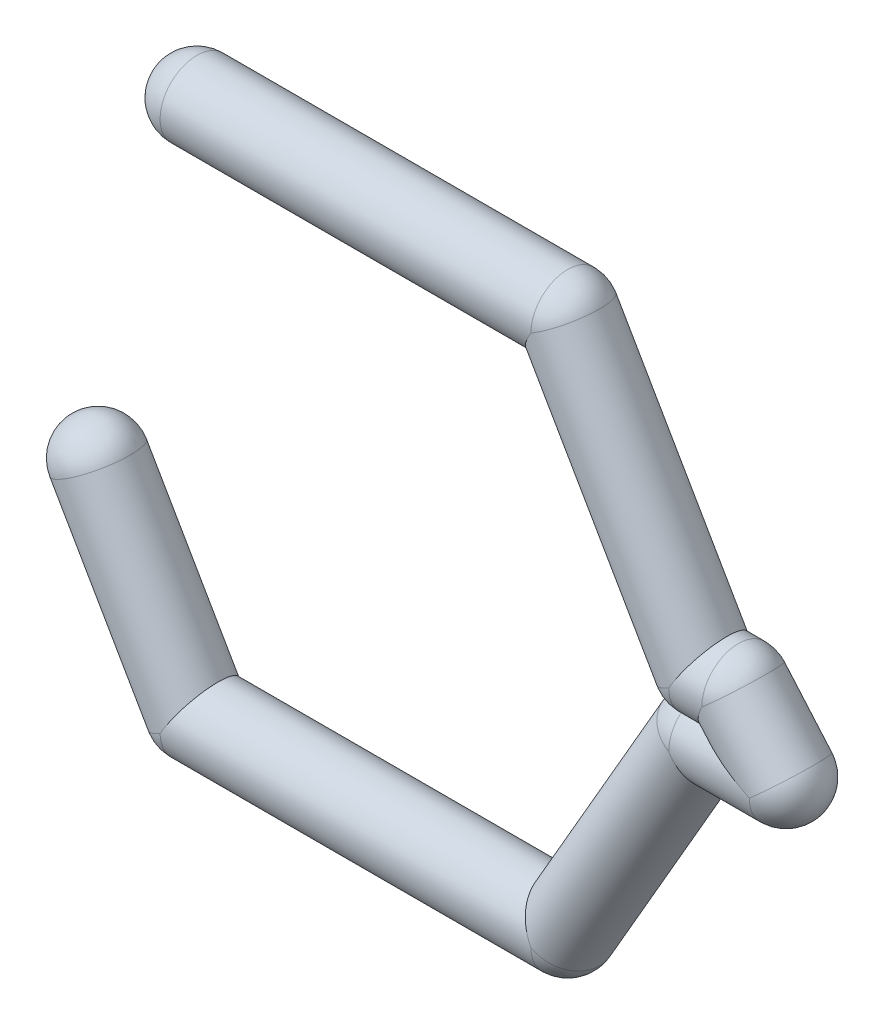
ISO-10303-21;
HEADER;
FILE_DESCRIPTION(('STEP AP214'),'2;1');
FILE_NAME('part.step','',(''),(''),'','','');
FILE_SCHEMA(('AUTOMOTIVE_DESIGN { 1 0 10303 214 1 1 1 1 }'));
ENDSEC;
DATA;
#1=APPLICATION_CONTEXT('core data for automotive mechanical design processes');
#2=APPLICATION_PROTOCOL_DEFINITION('international standard','automotive_design',2000,#1);
#3=PRODUCT_CONTEXT('',#1,'mechanical');
#4=PRODUCT('Part','Part','',(#3));
#5=PRODUCT_RELATED_PRODUCT_CATEGORY('part','',(#4));
#6=PRODUCT_DEFINITION_FORMATION('','',#4);
#7=PRODUCT_DEFINITION_CONTEXT('part definition',#1,'design');
#8=PRODUCT_DEFINITION('design','',#6,#7);
#9=PRODUCT_DEFINITION_SHAPE('','',#8);
#10=(LENGTH_UNIT() NAMED_UNIT(*) SI_UNIT(.MILLI.,.METRE.));
#11=(NAMED_UNIT(*) PLANE_ANGLE_UNIT() SI_UNIT($,.RADIAN.));
#12=(NAMED_UNIT(*) SI_UNIT($,.STERADIAN.) SOLID_ANGLE_UNIT());
#13=UNCERTAINTY_MEASURE_WITH_UNIT(LENGTH_MEASURE(1.E-05),#10,'distance_accuracy_value','');
#14=(GEOMETRIC_REPRESENTATION_CONTEXT(3) GLOBAL_UNCERTAINTY_ASSIGNED_CONTEXT((#13)) GLOBAL_UNIT_ASSIGNED_CONTEXT((#10,
#11,#12)) REPRESENTATION_CONTEXT('',''));
#15=CARTESIAN_POINT('',(0.,0.,0.));
#16=DIRECTION('',(0.,0.,1.));
#17=DIRECTION('',(1.,0.,0.));
#18=AXIS2_PLACEMENT_3D('',#15,#16,#17);
#19=CARTESIAN_POINT('',(-15.16,-4.283,1.125));
#20=DIRECTION('',(1.,0.,0.));
#21=DIRECTION('',(0.,-1.,0.));
#22=AXIS2_PLACEMENT_3D('',#19,#20,#21);
#23=SPHERICAL_SURFACE('',#22,0.24);
#24=CARTESIAN_POINT('',(-15.16,-4.283,1.125));
#25=DIRECTION('',(-0.500057999393756,0.865991915229187,0.));
#26=DIRECTION('',(-0.865991915229187,-0.500057999393756,0.));
#27=AXIS2_PLACEMENT_3D('',#24,#25,#26);
#28=SPHERICAL_SURFACE('',#27,0.24);
#29=CARTESIAN_POINT('',(-15.16,-4.283,1.125));
#30=DIRECTION('',(-0.500057999393756,0.865991915229187,0.));
#31=DIRECTION('',(-0.865991915229187,-0.500057999393756,0.));
#32=AXIS2_PLACEMENT_3D('',#29,#30,#31);
#33=CIRCLE('',#32,0.24);
#34=CARTESIAN_POINT('',(-15.367838059655,-4.4030139198545,1.125));
#35=VERTEX_POINT('',#34);
#36=EDGE_CURVE('E88',#35,#35,#33,.F.);
#37=ORIENTED_EDGE('',*,*,#36,.F.);
#38=EDGE_LOOP('',(#37));
#39=FACE_BOUND('',#38,.T.);
#40=ADVANCED_FACE('F81',(#39),#28,.T.);
#41=CARTESIAN_POINT('',(-14.515,-5.4,1.125));
#42=DIRECTION('',(-0.500057999393756,0.865991915229187,0.));
#43=DIRECTION('',(-0.865991915229187,-0.500057999393756,0.));
#44=AXIS2_PLACEMENT_3D('',#41,#42,#43);
#45=CYLINDRICAL_SURFACE('',#44,0.240000000000001);
#46=CARTESIAN_POINT('',(-14.515,-5.4,1.125));
#47=DIRECTION('',(-0.866042146605393,0.499970999462091,0.));
#48=DIRECTION('',(0.499970999462091,0.866042146605394,0.));
#49=AXIS2_PLACEMENT_3D('',#46,#47,#48);
#50=ELLIPSE('',#49,0.277122771611893,0.24);
#51=CARTESIAN_POINT('',(-14.515,-5.4,0.884999999999999));
#52=VERTEX_POINT('',#51);
#53=CARTESIAN_POINT('',(-14.515,-5.4,1.365));
#54=VERTEX_POINT('',#53);
#55=EDGE_CURVE('E12',#52,#54,#50,.F.);
#56=ORIENTED_EDGE('',*,*,#55,.F.);
#57=CARTESIAN_POINT('',(-14.515,-5.4,1.125));
#58=DIRECTION('',(-0.500057999393757,0.865991915229186,0.));
#59=DIRECTION('',(-0.865991915229186,-0.500057999393757,0.));
#60=AXIS2_PLACEMENT_3D('',#57,#58,#59);
#61=CIRCLE('',#60,0.240000000000001);
#62=EDGE_CURVE('E94',#52,#54,#61,.T.);
#63=ORIENTED_EDGE('',*,*,#62,.T.);
#64=EDGE_LOOP('',(#56,#63));
#65=FACE_BOUND('',#64,.T.);
#66=ORIENTED_EDGE('',*,*,#36,.T.);
#67=EDGE_LOOP('',(#66));
#68=FACE_BOUND('',#67,.T.);
#69=ADVANCED_FACE('F212',(#65,#68),#45,.T.);
#70=CARTESIAN_POINT('',(-14.515,-5.4,1.125));
#71=DIRECTION('',(1.,0.,0.));
#72=DIRECTION('',(0.,-1.,0.));
#73=AXIS2_PLACEMENT_3D('',#70,#71,#72);
#74=SPHERICAL_SURFACE('',#73,0.24);
#75=ORIENTED_EDGE('',*,*,#62,.F.);
#76=CARTESIAN_POINT('',(-14.515,-5.4,1.125));
#77=DIRECTION('',(-1.,0.,0.));
#78=DIRECTION('',(0.,0.,1.));
#79=AXIS2_PLACEMENT_3D('',#76,#77,#78);
#80=CIRCLE('',#79,0.24);
#81=EDGE_CURVE('E203',#54,#52,#80,.F.);
#82=ORIENTED_EDGE('',*,*,#81,.F.);
#83=EDGE_LOOP('',(#75,#82));
#84=FACE_BOUND('',#83,.T.);
#85=ADVANCED_FACE('F218',(#84),#74,.T.);
#86=CARTESIAN_POINT('',(-12.09,-5.4,1.125));
#87=DIRECTION('',(-1.,0.,0.));
#88=DIRECTION('',(0.,0.,1.));
#89=AXIS2_PLACEMENT_3D('',#86,#87,#88);
#90=CYLINDRICAL_SURFACE('',#89,0.24);
#91=CARTESIAN_POINT('',(-12.09,-5.4,1.125));
#92=DIRECTION('',(-0.866065491045954,-0.499930560397472,0.));
#93=DIRECTION('',(-0.499930560397472,0.866065491045954,0.));
#94=AXIS2_PLACEMENT_3D('',#91,#92,#93);
#95=ELLIPSE('',#94,0.277115301881097,0.24);
#96=CARTESIAN_POINT('',(-12.09,-5.4,0.885));
#97=VERTEX_POINT('',#96);
#98=CARTESIAN_POINT('',(-12.09,-5.4,1.365));
#99=VERTEX_POINT('',#98);
#100=EDGE_CURVE('E206',#97,#99,#95,.F.);
#101=ORIENTED_EDGE('',*,*,#100,.F.);
#102=CARTESIAN_POINT('',(-12.09,-5.4,1.125));
#103=DIRECTION('',(-1.,0.,0.));
#104=DIRECTION('',(0.,0.,1.));
#105=AXIS2_PLACEMENT_3D('',#102,#103,#104);
#106=CIRCLE('',#105,0.24);
#107=EDGE_CURVE('E201',#97,#99,#106,.T.);
#108=ORIENTED_EDGE('',*,*,#107,.T.);
#109=EDGE_LOOP('',(#101,#108));
#110=FACE_BOUND('',#109,.T.);
#111=ORIENTED_EDGE('',*,*,#81,.T.);
#112=ORIENTED_EDGE('',*,*,#55,.T.);
#113=EDGE_LOOP('',(#111,#112));
#114=FACE_BOUND('',#113,.T.);
#115=ADVANCED_FACE('F222',(#110,#114),#90,.T.);
#116=CARTESIAN_POINT('',(-12.09,-5.4,1.125));
#117=DIRECTION('',(1.,0.,0.));
#118=DIRECTION('',(0.,-1.,0.));
#119=AXIS2_PLACEMENT_3D('',#116,#117,#118);
#120=SPHERICAL_SURFACE('',#119,0.24);
#121=ORIENTED_EDGE('',*,*,#107,.F.);
#122=CARTESIAN_POINT('',(-12.09,-5.4,1.125));
#123=DIRECTION('',(-0.500138869561338,-0.865945212559032,0.));
#124=DIRECTION('',(0.865945212559032,-0.500138869561338,0.));
#125=AXIS2_PLACEMENT_3D('',#122,#123,#124);
#126=CIRCLE('',#125,0.24);
#127=EDGE_CURVE('E196',#99,#97,#126,.F.);
#128=ORIENTED_EDGE('',*,*,#127,.F.);
#129=EDGE_LOOP('',(#121,#128));
#130=FACE_BOUND('',#129,.T.);
#131=ADVANCED_FACE('F227',(#130),#120,.T.);
#132=CARTESIAN_POINT('',(-11.189,-3.84,1.125));
#133=DIRECTION('',(-0.500138869561338,-0.865945212559032,0.));
#134=DIRECTION('',(0.865945212559032,-0.500138869561338,0.));
#135=AXIS2_PLACEMENT_3D('',#132,#133,#134);
#136=CYLINDRICAL_SURFACE('',#135,0.240000000000001);
#137=CARTESIAN_POINT('',(-11.189,-3.84,1.125));
#138=DIRECTION('',(-0.866065491045954,-0.499930560397472,0.));
#139=DIRECTION('',(0.499930560397472,-0.866065491045954,0.));
#140=AXIS2_PLACEMENT_3D('',#137,#138,#139);
#141=ELLIPSE('',#140,0.277115301881097,0.24);
#142=CARTESIAN_POINT('',(-11.189,-3.84,1.365));
#143=VERTEX_POINT('',#142);
#144=CARTESIAN_POINT('',(-11.189,-3.84,0.885));
#145=VERTEX_POINT('',#144);
#146=EDGE_CURVE('E199',#143,#145,#141,.F.);
#147=ORIENTED_EDGE('',*,*,#146,.F.);
#148=CARTESIAN_POINT('',(-11.189,-3.84,1.125));
#149=DIRECTION('',(-0.500138869561338,-0.865945212559032,0.));
#150=DIRECTION('',(0.865945212559032,-0.500138869561338,0.));
#151=AXIS2_PLACEMENT_3D('',#148,#149,#150);
#152=CIRCLE('',#151,0.240000000000001);
#153=EDGE_CURVE('E156',#143,#145,#152,.T.);
#154=ORIENTED_EDGE('',*,*,#153,.T.);
#155=EDGE_LOOP('',(#147,#154));
#156=FACE_BOUND('',#155,.T.);
#157=ORIENTED_EDGE('',*,*,#127,.T.);
#158=ORIENTED_EDGE('',*,*,#100,.T.);
#159=EDGE_LOOP('',(#157,#158));
#160=FACE_BOUND('',#159,.T.);
#161=ADVANCED_FACE('F231',(#156,#160),#136,.T.);
#162=CARTESIAN_POINT('',(-11.189,-3.84,1.125));
#163=DIRECTION('',(1.,0.,0.));
#164=DIRECTION('',(0.,-1.,0.));
#165=AXIS2_PLACEMENT_3D('',#162,#163,#164);
#166=SPHERICAL_SURFACE('',#165,0.24);
#167=ORIENTED_EDGE('',*,*,#153,.F.);
#168=CARTESIAN_POINT('',(-11.189,-3.84,1.125));
#169=DIRECTION('',(-1.,0.,0.));
#170=DIRECTION('',(0.,0.,1.));
#171=AXIS2_PLACEMENT_3D('',#168,#169,#170);
#172=CIRCLE('',#171,0.24);
#173=CARTESIAN_POINT('',(-11.189,-3.66,1.28374507866388));
#174=VERTEX_POINT('',#173);
#175=EDGE_CURVE('E149',#143,#174,#172,.T.);
#176=ORIENTED_EDGE('',*,*,#175,.T.);
#177=CARTESIAN_POINT('',(-11.189,-3.66,1.125));
#178=DIRECTION('',(0.,-1.,0.));
#179=DIRECTION('',(0.,0.,-1.));
#180=AXIS2_PLACEMENT_3D('',#177,#178,#179);
#181=CIRCLE('',#180,0.158745078663876);
#182=CARTESIAN_POINT('',(-11.189,-3.66,0.966254921336124));
#183=VERTEX_POINT('',#182);
#184=EDGE_CURVE('E154',#174,#183,#181,.T.);
#185=ORIENTED_EDGE('',*,*,#184,.T.);
#186=EDGE_CURVE('E160',#183,#145,#172,.T.);
#187=ORIENTED_EDGE('',*,*,#186,.T.);
#188=EDGE_LOOP('',(#167,#176,#185,#187));
#189=FACE_BOUND('',#188,.T.);
#190=ADVANCED_FACE('F151',(#189),#166,.T.);
#191=CARTESIAN_POINT('',(-10.662,-3.84,1.125));
#192=DIRECTION('',(1.,0.,0.));
#193=DIRECTION('',(0.,-1.,0.));
#194=AXIS2_PLACEMENT_3D('',#191,#192,#193);
#195=SPHERICAL_SURFACE('',#194,0.24);
#196=CARTESIAN_POINT('',(-10.662,-3.84,1.125));
#197=DIRECTION('',(0.653729317990233,-0.756728470985481,0.));
#198=DIRECTION('',(0.756728470985481,0.653729317990233,0.));
#199=AXIS2_PLACEMENT_3D('',#196,#197,#198);
#200=CIRCLE('',#199,0.24);
#201=CARTESIAN_POINT('',(-10.662,-3.84000000000001,1.365));
#202=VERTEX_POINT('',#201);
#203=CARTESIAN_POINT('',(-10.662,-3.84000000000001,0.885));
#204=VERTEX_POINT('',#203);
#205=EDGE_CURVE('E388',#202,#204,#200,.F.);
#206=ORIENTED_EDGE('',*,*,#205,.F.);
#207=CARTESIAN_POINT('',(-10.662,-3.84,1.125));
#208=DIRECTION('',(-1.,0.,0.));
#209=DIRECTION('',(0.,0.,1.));
#210=AXIS2_PLACEMENT_3D('',#207,#208,#209);
#211=CIRCLE('',#210,0.24);
#212=EDGE_CURVE('E161',#204,#202,#211,.T.);
#213=ORIENTED_EDGE('',*,*,#212,.F.);
#214=EDGE_LOOP('',(#206,#213));
#215=FACE_BOUND('',#214,.T.);
#216=ADVANCED_FACE('F236',(#215),#195,.T.);
#217=CARTESIAN_POINT('',(-10.973,-3.48,1.125));
#218=DIRECTION('',(0.653729317990233,-0.756728470985481,0.));
#219=DIRECTION('',(0.756728470985481,0.653729317990233,0.));
#220=AXIS2_PLACEMENT_3D('',#217,#218,#219);
#221=CYLINDRICAL_SURFACE('',#220,0.240000000000001);
#222=CARTESIAN_POINT('',(-10.662,-3.84,1.125));
#223=DIRECTION('',(-0.416095350857088,-0.909320987877832,0.));
#224=DIRECTION('',(0.909320987877832,-0.416095350857088,0.));
#225=AXIS2_PLACEMENT_3D('',#222,#223,#224);
#226=ELLIPSE('',#225,0.576790871384743,0.24);
#227=CARTESIAN_POINT('',(-11.0553660337249,-3.66,1.28374507866388));
#228=VERTEX_POINT('',#227);
#229=EDGE_CURVE('E184',#202,#228,#226,.T.);
#230=ORIENTED_EDGE('',*,*,#229,.F.);
#231=ORIENTED_EDGE('',*,*,#205,.T.);
#232=CARTESIAN_POINT('',(-11.0553660337249,-3.66,0.966254921336124));
#233=VERTEX_POINT('',#232);
#234=EDGE_CURVE('E394',#233,#204,#226,.T.);
#235=ORIENTED_EDGE('',*,*,#234,.F.);
#236=CARTESIAN_POINT('',(-10.973,-3.48,1.125));
#237=DIRECTION('',(0.909320987877832,-0.416095350857088,0.));
#238=DIRECTION('',(-0.416095350857088,-0.909320987877832,0.));
#239=AXIS2_PLACEMENT_3D('',#236,#237,#238);
#240=ELLIPSE('',#239,0.263933202025954,0.24);
#241=CARTESIAN_POINT('',(-10.973,-3.48,0.885));
#242=VERTEX_POINT('',#241);
#243=EDGE_CURVE('E186',#242,#233,#240,.F.);
#244=ORIENTED_EDGE('',*,*,#243,.F.);
#245=CARTESIAN_POINT('',(-10.973,-3.48,1.125));
#246=DIRECTION('',(0.65372931799024,-0.756728470985475,0.));
#247=DIRECTION('',(0.756728470985475,0.65372931799024,0.));
#248=AXIS2_PLACEMENT_3D('',#245,#246,#247);
#249=CIRCLE('',#248,0.240000000000001);
#250=CARTESIAN_POINT('',(-10.973,-3.48,1.365));
#251=VERTEX_POINT('',#250);
#252=EDGE_CURVE('E383',#242,#251,#249,.T.);
#253=ORIENTED_EDGE('',*,*,#252,.T.);
#254=EDGE_CURVE('E191',#228,#251,#240,.F.);
#255=ORIENTED_EDGE('',*,*,#254,.F.);
#256=EDGE_LOOP('',(#230,#231,#235,#244,#253,#255));
#257=FACE_BOUND('',#256,.T.);
#258=ADVANCED_FACE('F239',(#257),#221,.T.);
#259=CARTESIAN_POINT('',(-10.973,-3.48,1.125));
#260=DIRECTION('',(1.,0.,0.));
#261=DIRECTION('',(0.,-1.,0.));
#262=AXIS2_PLACEMENT_3D('',#259,#260,#261);
#263=SPHERICAL_SURFACE('',#262,0.24);
#264=ORIENTED_EDGE('',*,*,#252,.F.);
#265=CARTESIAN_POINT('',(-10.973,-3.48,1.125));
#266=DIRECTION('',(1.,0.,0.));
#267=DIRECTION('',(0.,0.,-1.));
#268=AXIS2_PLACEMENT_3D('',#265,#266,#267);
#269=CIRCLE('',#268,0.24);
#270=EDGE_CURVE('E380',#251,#242,#269,.F.);
#271=ORIENTED_EDGE('',*,*,#270,.F.);
#272=EDGE_LOOP('',(#264,#271));
#273=FACE_BOUND('',#272,.T.);
#274=ADVANCED_FACE('F243',(#273),#263,.T.);
#275=CARTESIAN_POINT('',(-11.189,-3.48,1.125));
#276=DIRECTION('',(1.,0.,0.));
#277=DIRECTION('',(0.,-1.,0.));
#278=AXIS2_PLACEMENT_3D('',#275,#276,#277);
#279=SPHERICAL_SURFACE('',#278,0.24);
#280=CARTESIAN_POINT('',(-11.189,-3.48,1.125));
#281=DIRECTION('',(0.500138869561339,-0.865945212559032,0.));
#282=DIRECTION('',(0.865945212559032,0.500138869561339,0.));
#283=AXIS2_PLACEMENT_3D('',#280,#281,#282);
#284=CIRCLE('',#283,0.24);
#285=CARTESIAN_POINT('',(-11.189,-3.48,0.885));
#286=VERTEX_POINT('',#285);
#287=CARTESIAN_POINT('',(-11.189,-3.48,1.365));
#288=VERTEX_POINT('',#287);
#289=EDGE_CURVE('E374',#286,#288,#284,.F.);
#290=ORIENTED_EDGE('',*,*,#289,.F.);
#291=CARTESIAN_POINT('',(-11.189,-3.48,1.125));
#292=DIRECTION('',(1.,0.,0.));
#293=DIRECTION('',(0.,0.,-1.));
#294=AXIS2_PLACEMENT_3D('',#291,#292,#293);
#295=CIRCLE('',#294,0.24);
#296=EDGE_CURVE('E175',#183,#286,#295,.T.);
#297=ORIENTED_EDGE('',*,*,#296,.F.);
#298=ORIENTED_EDGE('',*,*,#184,.F.);
#299=EDGE_CURVE('E165',#288,#174,#295,.T.);
#300=ORIENTED_EDGE('',*,*,#299,.F.);
#301=EDGE_LOOP('',(#290,#297,#298,#300));
#302=FACE_BOUND('',#301,.T.);
#303=ADVANCED_FACE('F177',(#302),#279,.T.);
#304=CARTESIAN_POINT('',(-12.09,-1.92,1.125));
#305=DIRECTION('',(0.500138869561339,-0.865945212559032,0.));
#306=DIRECTION('',(0.865945212559032,0.500138869561339,0.));
#307=AXIS2_PLACEMENT_3D('',#304,#305,#306);
#308=CYLINDRICAL_SURFACE('',#307,0.240000000000001);
#309=CARTESIAN_POINT('',(-11.189,-3.48,1.125));
#310=DIRECTION('',(0.866065491045954,-0.499930560397472,0.));
#311=DIRECTION('',(-0.499930560397472,-0.866065491045954,0.));
#312=AXIS2_PLACEMENT_3D('',#309,#310,#311);
#313=ELLIPSE('',#312,0.277115301881097,0.24);
#314=EDGE_CURVE('E171',#286,#288,#313,.T.);
#315=ORIENTED_EDGE('',*,*,#314,.F.);
#316=ORIENTED_EDGE('',*,*,#289,.T.);
#317=EDGE_LOOP('',(#315,#316));
#318=FACE_BOUND('',#317,.T.);
#319=CARTESIAN_POINT('',(-12.09,-1.92,1.125));
#320=DIRECTION('',(0.866065491045954,-0.499930560397472,0.));
#321=DIRECTION('',(-0.499930560397472,-0.866065491045954,0.));
#322=AXIS2_PLACEMENT_3D('',#319,#320,#321);
#323=ELLIPSE('',#322,0.277115301881097,0.24);
#324=CARTESIAN_POINT('',(-12.09,-1.92,0.885));
#325=VERTEX_POINT('',#324);
#326=CARTESIAN_POINT('',(-12.09,-1.92,1.365));
#327=VERTEX_POINT('',#326);
#328=EDGE_CURVE('E377',#325,#327,#323,.F.);
#329=ORIENTED_EDGE('',*,*,#328,.F.);
#330=CARTESIAN_POINT('',(-12.09,-1.92,1.125));
#331=DIRECTION('',(0.500138869561338,-0.865945212559032,0.));
#332=DIRECTION('',(0.865945212559032,0.500138869561338,0.));
#333=AXIS2_PLACEMENT_3D('',#330,#331,#332);
#334=CIRCLE('',#333,0.240000000000001);
#335=EDGE_CURVE('E178',#325,#327,#334,.T.);
#336=ORIENTED_EDGE('',*,*,#335,.T.);
#337=EDGE_LOOP('',(#329,#336));
#338=FACE_BOUND('',#337,.T.);
#339=ADVANCED_FACE('F247',(#318,#338),#308,.T.);
#340=CARTESIAN_POINT('',(-12.09,-1.92,1.125));
#341=DIRECTION('',(1.,0.,0.));
#342=DIRECTION('',(0.,-1.,0.));
#343=AXIS2_PLACEMENT_3D('',#340,#341,#342);
#344=SPHERICAL_SURFACE('',#343,0.24);
#345=ORIENTED_EDGE('',*,*,#335,.F.);
#346=CARTESIAN_POINT('',(-12.09,-1.92,1.125));
#347=DIRECTION('',(1.,0.,0.));
#348=DIRECTION('',(0.,0.,-1.));
#349=AXIS2_PLACEMENT_3D('',#346,#347,#348);
#350=CIRCLE('',#349,0.24);
#351=EDGE_CURVE('E179',#325,#327,#350,.T.);
#352=ORIENTED_EDGE('',*,*,#351,.T.);
#353=EDGE_LOOP('',(#345,#352));
#354=FACE_BOUND('',#353,.T.);
#355=ADVANCED_FACE('F250',(#354),#344,.T.);
#356=CARTESIAN_POINT('',(-14.515,-1.92,1.125));
#357=DIRECTION('',(1.,0.,0.));
#358=DIRECTION('',(0.,0.,-1.));
#359=AXIS2_PLACEMENT_3D('',#356,#357,#358);
#360=CYLINDRICAL_SURFACE('',#359,0.24);
#361=ORIENTED_EDGE('',*,*,#351,.F.);
#362=ORIENTED_EDGE('',*,*,#328,.T.);
#363=EDGE_LOOP('',(#361,#362));
#364=FACE_BOUND('',#363,.T.);
#365=CARTESIAN_POINT('',(-14.515,-1.92,1.125));
#366=DIRECTION('',(1.,0.,0.));
#367=DIRECTION('',(0.,0.,-1.));
#368=AXIS2_PLACEMENT_3D('',#365,#366,#367);
#369=CIRCLE('',#368,0.24);
#370=CARTESIAN_POINT('',(-14.515,-1.92,0.885));
#371=VERTEX_POINT('',#370);
#372=EDGE_CURVE('E378',#371,#371,#369,.T.);
#373=ORIENTED_EDGE('',*,*,#372,.T.);
#374=EDGE_LOOP('',(#373));
#375=FACE_BOUND('',#374,.T.);
#376=ADVANCED_FACE('F260',(#364,#375),#360,.T.);
#377=CARTESIAN_POINT('',(-14.515,-1.92,1.125));
#378=DIRECTION('',(1.,0.,0.));
#379=DIRECTION('',(0.,-1.,0.));
#380=AXIS2_PLACEMENT_3D('',#377,#378,#379);
#381=SPHERICAL_SURFACE('',#380,0.24);
#382=ORIENTED_EDGE('',*,*,#372,.F.);
#383=EDGE_LOOP('',(#382));
#384=FACE_BOUND('',#383,.T.);
#385=ADVANCED_FACE('F257',(#384),#381,.T.);
#386=CARTESIAN_POINT('',(-11.189,-3.48,1.125));
#387=DIRECTION('',(1.,0.,0.));
#388=DIRECTION('',(0.,0.,-1.));
#389=AXIS2_PLACEMENT_3D('',#386,#387,#388);
#390=CYLINDRICAL_SURFACE('',#389,0.24);
#391=DIRECTION('',(-1.,0.,0.));
#392=VECTOR('',#391,1.);
#393=CARTESIAN_POINT('',(-10.9255,-3.66,0.966254921336124));
#394=LINE('',#393,#392);
#395=EDGE_CURVE('E185',#183,#233,#394,.F.);
#396=ORIENTED_EDGE('',*,*,#395,.F.);
#397=ORIENTED_EDGE('',*,*,#296,.T.);
#398=ORIENTED_EDGE('',*,*,#314,.T.);
#399=ORIENTED_EDGE('',*,*,#299,.T.);
#400=DIRECTION('',(-1.,0.,0.));
#401=VECTOR('',#400,1.);
#402=CARTESIAN_POINT('',(-10.9255,-3.66,1.28374507866388));
#403=LINE('',#402,#401);
#404=EDGE_CURVE('E168',#228,#174,#403,.T.);
#405=ORIENTED_EDGE('',*,*,#404,.F.);
#406=ORIENTED_EDGE('',*,*,#254,.T.);
#407=ORIENTED_EDGE('',*,*,#270,.T.);
#408=ORIENTED_EDGE('',*,*,#243,.T.);
#409=EDGE_LOOP('',(#396,#397,#398,#399,#405,#406,#407,#408));
#410=FACE_BOUND('',#409,.T.);
#411=ADVANCED_FACE('F167',(#410),#390,.T.);
#412=CARTESIAN_POINT('',(-10.662,-3.84,1.125));
#413=DIRECTION('',(-1.,0.,0.));
#414=DIRECTION('',(0.,0.,1.));
#415=AXIS2_PLACEMENT_3D('',#412,#413,#414);
#416=CYLINDRICAL_SURFACE('',#415,0.24);
#417=ORIENTED_EDGE('',*,*,#175,.F.);
#418=ORIENTED_EDGE('',*,*,#146,.T.);
#419=ORIENTED_EDGE('',*,*,#186,.F.);
#420=ORIENTED_EDGE('',*,*,#395,.T.);
#421=ORIENTED_EDGE('',*,*,#234,.T.);
#422=ORIENTED_EDGE('',*,*,#212,.T.);
#423=ORIENTED_EDGE('',*,*,#229,.T.);
#424=ORIENTED_EDGE('',*,*,#404,.T.);
#425=EDGE_LOOP('',(#417,#418,#419,#420,#421,#422,#423,#424));
#426=FACE_BOUND('',#425,.T.);
#427=ADVANCED_FACE('F182',(#426),#416,.T.);
#428=CLOSED_SHELL('',(#40,#69,#85,#115,#131,#161,#190,#216,#258,#274,#303,#339,#355,#376,#385,
#411,#427));
#429=MANIFOLD_SOLID_BREP('B2',#428);
#430=ADVANCED_BREP_SHAPE_REPRESENTATION('',(#18,#429),#14);
#431=SHAPE_DEFINITION_REPRESENTATION(#9,#430);
ENDSEC;
END-ISO-10303-21;
